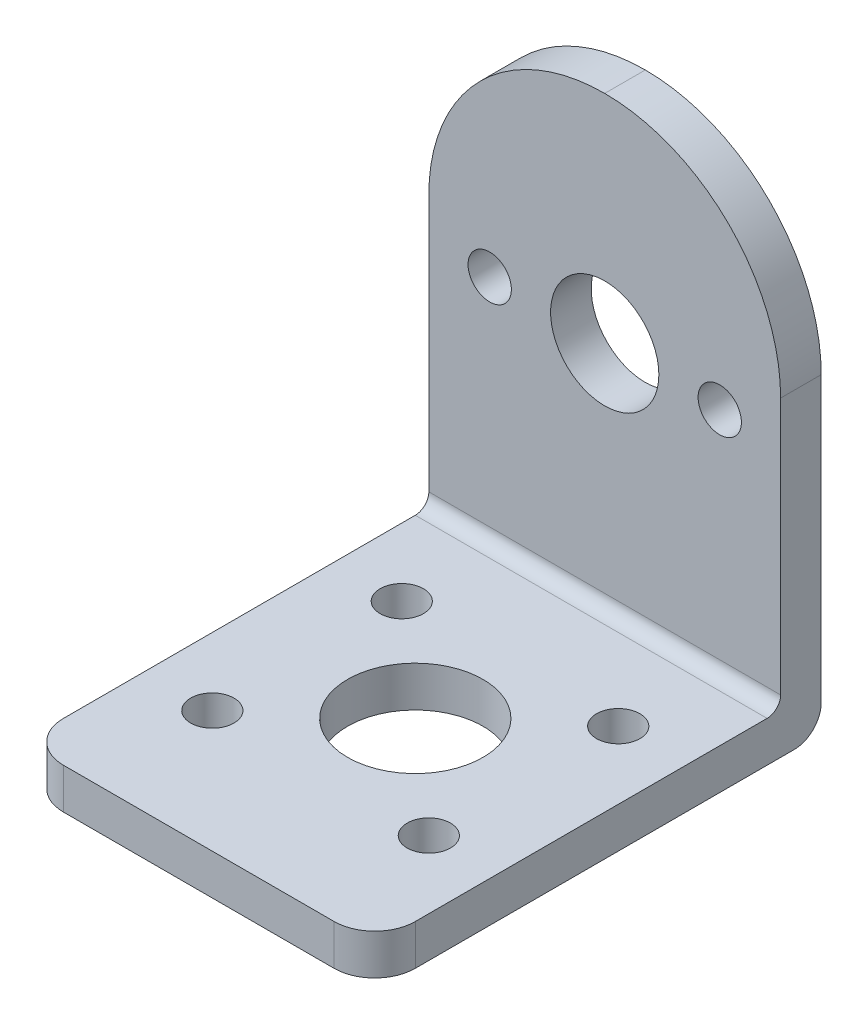
ISO-10303-21;
HEADER;
FILE_DESCRIPTION(('STEP AP214'),'2;1');
FILE_NAME('part.step','',(''),(''),'','','');
FILE_SCHEMA(('AUTOMOTIVE_DESIGN { 1 0 10303 214 1 1 1 1 }'));
ENDSEC;
DATA;
#1=APPLICATION_CONTEXT('core data for automotive mechanical design processes');
#2=APPLICATION_PROTOCOL_DEFINITION('international standard','automotive_design',2000,#1);
#3=PRODUCT_CONTEXT('',#1,'mechanical');
#4=PRODUCT('Part','Part','',(#3));
#5=PRODUCT_RELATED_PRODUCT_CATEGORY('part','',(#4));
#6=PRODUCT_DEFINITION_FORMATION('','',#4);
#7=PRODUCT_DEFINITION_CONTEXT('part definition',#1,'design');
#8=PRODUCT_DEFINITION('design','',#6,#7);
#9=PRODUCT_DEFINITION_SHAPE('','',#8);
#10=(LENGTH_UNIT() NAMED_UNIT(*) SI_UNIT(.MILLI.,.METRE.));
#11=(NAMED_UNIT(*) PLANE_ANGLE_UNIT() SI_UNIT($,.RADIAN.));
#12=(NAMED_UNIT(*) SI_UNIT($,.STERADIAN.) SOLID_ANGLE_UNIT());
#13=UNCERTAINTY_MEASURE_WITH_UNIT(LENGTH_MEASURE(1.E-05),#10,'distance_accuracy_value','');
#14=(GEOMETRIC_REPRESENTATION_CONTEXT(3) GLOBAL_UNCERTAINTY_ASSIGNED_CONTEXT((#13)) GLOBAL_UNIT_ASSIGNED_CONTEXT((#10,
#11,#12)) REPRESENTATION_CONTEXT('',''));
#15=CARTESIAN_POINT('',(0.,0.,0.));
#16=DIRECTION('',(0.,0.,1.));
#17=DIRECTION('',(1.,0.,0.));
#18=AXIS2_PLACEMENT_3D('',#15,#16,#17);
#19=CARTESIAN_POINT('',(0.,3.,0.));
#20=DIRECTION('',(0.,1.,0.));
#21=DIRECTION('',(0.,0.,1.));
#22=AXIS2_PLACEMENT_3D('',#19,#20,#21);
#23=PLANE('',#22);
#24=DIRECTION('',(0.,0.,-1.));
#25=VECTOR('',#24,1.);
#26=CARTESIAN_POINT('',(13.,3.,-16.5));
#27=LINE('',#26,#25);
#28=CARTESIAN_POINT('',(13.,3.,13.5));
#29=VERTEX_POINT('',#28);
#30=CARTESIAN_POINT('',(13.,3.,-12.5));
#31=VERTEX_POINT('',#30);
#32=EDGE_CURVE('E151',#29,#31,#27,.T.);
#33=ORIENTED_EDGE('',*,*,#32,.T.);
#34=DIRECTION('',(1.,0.,0.));
#35=VECTOR('',#34,1.);
#36=CARTESIAN_POINT('',(0.,3.,-12.5));
#37=LINE('',#36,#35);
#38=CARTESIAN_POINT('',(-13.,3.,-12.5));
#39=VERTEX_POINT('',#38);
#40=EDGE_CURVE('E61',#31,#39,#37,.F.);
#41=ORIENTED_EDGE('',*,*,#40,.T.);
#42=DIRECTION('',(0.,0.,1.));
#43=VECTOR('',#42,1.);
#44=CARTESIAN_POINT('',(-13.,3.,-16.5));
#45=LINE('',#44,#43);
#46=CARTESIAN_POINT('',(-13.,3.,13.5));
#47=VERTEX_POINT('',#46);
#48=EDGE_CURVE('E156',#39,#47,#45,.T.);
#49=ORIENTED_EDGE('',*,*,#48,.T.);
#50=CARTESIAN_POINT('',(-9.99999999999999,3.,13.5));
#51=DIRECTION('',(0.,1.,0.));
#52=DIRECTION('',(0.,0.,1.));
#53=AXIS2_PLACEMENT_3D('',#50,#51,#52);
#54=CIRCLE('',#53,3.);
#55=CARTESIAN_POINT('',(-9.99999999999999,3.,16.5));
#56=VERTEX_POINT('',#55);
#57=EDGE_CURVE('E179',#47,#56,#54,.T.);
#58=ORIENTED_EDGE('',*,*,#57,.T.);
#59=DIRECTION('',(1.,0.,0.));
#60=VECTOR('',#59,1.);
#61=CARTESIAN_POINT('',(-13.,3.,16.5));
#62=LINE('',#61,#60);
#63=CARTESIAN_POINT('',(10.,3.,16.5));
#64=VERTEX_POINT('',#63);
#65=EDGE_CURVE('E143',#56,#64,#62,.T.);
#66=ORIENTED_EDGE('',*,*,#65,.T.);
#67=CARTESIAN_POINT('',(10.,3.,13.5));
#68=DIRECTION('',(0.,1.,0.));
#69=DIRECTION('',(0.,0.,1.));
#70=AXIS2_PLACEMENT_3D('',#67,#68,#69);
#71=CIRCLE('',#70,3.);
#72=EDGE_CURVE('E176',#64,#29,#71,.T.);
#73=ORIENTED_EDGE('',*,*,#72,.T.);
#74=EDGE_LOOP('',(#33,#41,#49,#58,#66,#73));
#75=FACE_BOUND('',#74,.T.);
#76=CARTESIAN_POINT('',(7.99999999999999,3.,7.49999999999999));
#77=DIRECTION('',(0.,1.,0.));
#78=DIRECTION('',(0.,0.,-1.));
#79=AXIS2_PLACEMENT_3D('',#76,#77,#78);
#80=CIRCLE('',#79,1.6);
#81=CARTESIAN_POINT('',(7.99999999999999,3.,5.89999999999999));
#82=VERTEX_POINT('',#81);
#83=EDGE_CURVE('E261',#82,#82,#80,.T.);
#84=ORIENTED_EDGE('',*,*,#83,.F.);
#85=EDGE_LOOP('',(#84));
#86=FACE_BOUND('',#85,.T.);
#87=CARTESIAN_POINT('',(8.,3.,-6.5));
#88=DIRECTION('',(0.,1.,0.));
#89=DIRECTION('',(0.,0.,1.));
#90=AXIS2_PLACEMENT_3D('',#87,#88,#89);
#91=CIRCLE('',#90,1.6);
#92=CARTESIAN_POINT('',(8.,3.,-4.9));
#93=VERTEX_POINT('',#92);
#94=EDGE_CURVE('E247',#93,#93,#91,.T.);
#95=ORIENTED_EDGE('',*,*,#94,.F.);
#96=EDGE_LOOP('',(#95));
#97=FACE_BOUND('',#96,.T.);
#98=CARTESIAN_POINT('',(0.,3.,0.5));
#99=DIRECTION('',(0.,1.,0.));
#100=DIRECTION('',(0.,0.,1.));
#101=AXIS2_PLACEMENT_3D('',#98,#99,#100);
#102=CIRCLE('',#101,5.);
#103=CARTESIAN_POINT('',(0.,3.,5.5));
#104=VERTEX_POINT('',#103);
#105=EDGE_CURVE('E237',#104,#104,#102,.T.);
#106=ORIENTED_EDGE('',*,*,#105,.F.);
#107=EDGE_LOOP('',(#106));
#108=FACE_BOUND('',#107,.T.);
#109=CARTESIAN_POINT('',(-8.00000000000001,3.,-6.5));
#110=DIRECTION('',(0.,1.,0.));
#111=DIRECTION('',(0.,0.,-1.));
#112=AXIS2_PLACEMENT_3D('',#109,#110,#111);
#113=CIRCLE('',#112,1.6);
#114=CARTESIAN_POINT('',(-8.00000000000001,3.,-8.1));
#115=VERTEX_POINT('',#114);
#116=EDGE_CURVE('E253',#115,#115,#113,.T.);
#117=ORIENTED_EDGE('',*,*,#116,.F.);
#118=EDGE_LOOP('',(#117));
#119=FACE_BOUND('',#118,.T.);
#120=CARTESIAN_POINT('',(-8.00000000000001,3.,7.5));
#121=DIRECTION('',(0.,1.,0.));
#122=DIRECTION('',(0.,0.,1.));
#123=AXIS2_PLACEMENT_3D('',#120,#121,#122);
#124=CIRCLE('',#123,1.6);
#125=CARTESIAN_POINT('',(-8.00000000000001,3.,9.1));
#126=VERTEX_POINT('',#125);
#127=EDGE_CURVE('E269',#126,#126,#124,.T.);
#128=ORIENTED_EDGE('',*,*,#127,.F.);
#129=EDGE_LOOP('',(#128));
#130=FACE_BOUND('',#129,.T.);
#131=ADVANCED_FACE('F39',(#75,#86,#97,#108,#119,#130),#23,.T.);
#132=CARTESIAN_POINT('',(0.,0.,0.));
#133=DIRECTION('',(0.,1.,0.));
#134=DIRECTION('',(0.,0.,1.));
#135=AXIS2_PLACEMENT_3D('',#132,#133,#134);
#136=PLANE('',#135);
#137=DIRECTION('',(0.,0.,1.));
#138=VECTOR('',#137,1.);
#139=CARTESIAN_POINT('',(-13.,0.,-16.5));
#140=LINE('',#139,#138);
#141=CARTESIAN_POINT('',(-13.,0.,-14.5));
#142=VERTEX_POINT('',#141);
#143=CARTESIAN_POINT('',(-13.,0.,13.5));
#144=VERTEX_POINT('',#143);
#145=EDGE_CURVE('E152',#142,#144,#140,.T.);
#146=ORIENTED_EDGE('',*,*,#145,.F.);
#147=DIRECTION('',(-1.,0.,0.));
#148=VECTOR('',#147,1.);
#149=CARTESIAN_POINT('',(0.,0.,-14.5));
#150=LINE('',#149,#148);
#151=CARTESIAN_POINT('',(13.,0.,-14.5));
#152=VERTEX_POINT('',#151);
#153=EDGE_CURVE('E218',#142,#152,#150,.F.);
#154=ORIENTED_EDGE('',*,*,#153,.T.);
#155=DIRECTION('',(0.,0.,-1.));
#156=VECTOR('',#155,1.);
#157=CARTESIAN_POINT('',(13.,0.,-16.5));
#158=LINE('',#157,#156);
#159=CARTESIAN_POINT('',(13.,0.,13.5));
#160=VERTEX_POINT('',#159);
#161=EDGE_CURVE('E158',#160,#152,#158,.T.);
#162=ORIENTED_EDGE('',*,*,#161,.F.);
#163=CARTESIAN_POINT('',(10.,0.,13.5));
#164=DIRECTION('',(0.,1.,0.));
#165=DIRECTION('',(0.,0.,1.));
#166=AXIS2_PLACEMENT_3D('',#163,#164,#165);
#167=CIRCLE('',#166,3.);
#168=CARTESIAN_POINT('',(10.,0.,16.5));
#169=VERTEX_POINT('',#168);
#170=EDGE_CURVE('E134',#160,#169,#167,.F.);
#171=ORIENTED_EDGE('',*,*,#170,.T.);
#172=DIRECTION('',(1.,0.,0.));
#173=VECTOR('',#172,1.);
#174=CARTESIAN_POINT('',(-13.,0.,16.5));
#175=LINE('',#174,#173);
#176=CARTESIAN_POINT('',(-9.99999999999999,0.,16.5));
#177=VERTEX_POINT('',#176);
#178=EDGE_CURVE('E140',#177,#169,#175,.T.);
#179=ORIENTED_EDGE('',*,*,#178,.F.);
#180=CARTESIAN_POINT('',(-9.99999999999999,0.,13.5));
#181=DIRECTION('',(0.,1.,0.));
#182=DIRECTION('',(0.,0.,1.));
#183=AXIS2_PLACEMENT_3D('',#180,#181,#182);
#184=CIRCLE('',#183,3.);
#185=EDGE_CURVE('E123',#177,#144,#184,.F.);
#186=ORIENTED_EDGE('',*,*,#185,.T.);
#187=EDGE_LOOP('',(#146,#154,#162,#171,#179,#186));
#188=FACE_BOUND('',#187,.T.);
#189=CARTESIAN_POINT('',(0.,0.,0.5));
#190=DIRECTION('',(0.,1.,0.));
#191=DIRECTION('',(0.,0.,1.));
#192=AXIS2_PLACEMENT_3D('',#189,#190,#191);
#193=CIRCLE('',#192,5.);
#194=CARTESIAN_POINT('',(0.,0.,5.5));
#195=VERTEX_POINT('',#194);
#196=EDGE_CURVE('E241',#195,#195,#193,.T.);
#197=ORIENTED_EDGE('',*,*,#196,.T.);
#198=EDGE_LOOP('',(#197));
#199=FACE_BOUND('',#198,.T.);
#200=CARTESIAN_POINT('',(8.,0.,-6.5));
#201=DIRECTION('',(0.,1.,0.));
#202=DIRECTION('',(0.,0.,1.));
#203=AXIS2_PLACEMENT_3D('',#200,#201,#202);
#204=CIRCLE('',#203,1.6);
#205=CARTESIAN_POINT('',(8.,0.,-4.9));
#206=VERTEX_POINT('',#205);
#207=EDGE_CURVE('E249',#206,#206,#204,.T.);
#208=ORIENTED_EDGE('',*,*,#207,.T.);
#209=EDGE_LOOP('',(#208));
#210=FACE_BOUND('',#209,.T.);
#211=CARTESIAN_POINT('',(-8.00000000000001,0.,-6.5));
#212=DIRECTION('',(0.,1.,0.));
#213=DIRECTION('',(0.,0.,-1.));
#214=AXIS2_PLACEMENT_3D('',#211,#212,#213);
#215=CIRCLE('',#214,1.6);
#216=CARTESIAN_POINT('',(-8.00000000000001,0.,-8.1));
#217=VERTEX_POINT('',#216);
#218=EDGE_CURVE('E257',#217,#217,#215,.T.);
#219=ORIENTED_EDGE('',*,*,#218,.T.);
#220=EDGE_LOOP('',(#219));
#221=FACE_BOUND('',#220,.T.);
#222=CARTESIAN_POINT('',(7.99999999999999,0.,7.49999999999999));
#223=DIRECTION('',(0.,1.,0.));
#224=DIRECTION('',(0.,0.,-1.));
#225=AXIS2_PLACEMENT_3D('',#222,#223,#224);
#226=CIRCLE('',#225,1.6);
#227=CARTESIAN_POINT('',(7.99999999999999,0.,5.89999999999999));
#228=VERTEX_POINT('',#227);
#229=EDGE_CURVE('E265',#228,#228,#226,.T.);
#230=ORIENTED_EDGE('',*,*,#229,.T.);
#231=EDGE_LOOP('',(#230));
#232=FACE_BOUND('',#231,.T.);
#233=CARTESIAN_POINT('',(-8.00000000000001,0.,7.5));
#234=DIRECTION('',(0.,1.,0.));
#235=DIRECTION('',(0.,0.,1.));
#236=AXIS2_PLACEMENT_3D('',#233,#234,#235);
#237=CIRCLE('',#236,1.6);
#238=CARTESIAN_POINT('',(-8.00000000000001,0.,9.1));
#239=VERTEX_POINT('',#238);
#240=EDGE_CURVE('E273',#239,#239,#237,.T.);
#241=ORIENTED_EDGE('',*,*,#240,.T.);
#242=EDGE_LOOP('',(#241));
#243=FACE_BOUND('',#242,.T.);
#244=ADVANCED_FACE('F147',(#188,#199,#210,#221,#232,#243),#136,.F.);
#245=CARTESIAN_POINT('',(13.,3.,-16.5));
#246=DIRECTION('',(-1.,0.,0.));
#247=DIRECTION('',(0.,0.,1.));
#248=AXIS2_PLACEMENT_3D('',#245,#246,#247);
#249=PLANE('',#248);
#250=ORIENTED_EDGE('',*,*,#161,.T.);
#251=CARTESIAN_POINT('',(13.,2.,-14.5));
#252=DIRECTION('',(-1.,0.,0.));
#253=DIRECTION('',(0.,0.,1.));
#254=AXIS2_PLACEMENT_3D('',#251,#252,#253);
#255=CIRCLE('',#254,2.);
#256=CARTESIAN_POINT('',(13.,2.,-16.5));
#257=VERTEX_POINT('',#256);
#258=EDGE_CURVE('E221',#152,#257,#255,.F.);
#259=ORIENTED_EDGE('',*,*,#258,.T.);
#260=DIRECTION('',(0.,-1.,0.));
#261=VECTOR('',#260,1.);
#262=CARTESIAN_POINT('',(13.,3.,-16.5));
#263=LINE('',#262,#261);
#264=CARTESIAN_POINT('',(13.,23.,-16.5));
#265=VERTEX_POINT('',#264);
#266=EDGE_CURVE('E166',#265,#257,#263,.T.);
#267=ORIENTED_EDGE('',*,*,#266,.F.);
#268=DIRECTION('',(0.,0.,-1.));
#269=VECTOR('',#268,1.);
#270=CARTESIAN_POINT('',(13.,23.,-13.5));
#271=LINE('',#270,#269);
#272=CARTESIAN_POINT('',(13.,23.,-13.5));
#273=VERTEX_POINT('',#272);
#274=EDGE_CURVE('E202',#265,#273,#271,.F.);
#275=ORIENTED_EDGE('',*,*,#274,.T.);
#276=DIRECTION('',(0.,-1.,0.));
#277=VECTOR('',#276,1.);
#278=CARTESIAN_POINT('',(13.,36.,-13.5));
#279=LINE('',#278,#277);
#280=CARTESIAN_POINT('',(13.,4.,-13.5));
#281=VERTEX_POINT('',#280);
#282=EDGE_CURVE('E210',#273,#281,#279,.T.);
#283=ORIENTED_EDGE('',*,*,#282,.T.);
#284=CARTESIAN_POINT('',(13.,4.,-12.5));
#285=DIRECTION('',(-1.,0.,0.));
#286=DIRECTION('',(0.,0.,1.));
#287=AXIS2_PLACEMENT_3D('',#284,#285,#286);
#288=CIRCLE('',#287,1.);
#289=EDGE_CURVE('E48',#281,#31,#288,.T.);
#290=ORIENTED_EDGE('',*,*,#289,.T.);
#291=ORIENTED_EDGE('',*,*,#32,.F.);
#292=DIRECTION('',(0.,-1.,0.));
#293=VECTOR('',#292,1.);
#294=CARTESIAN_POINT('',(13.,3.,13.5));
#295=LINE('',#294,#293);
#296=EDGE_CURVE('E182',#29,#160,#295,.T.);
#297=ORIENTED_EDGE('',*,*,#296,.T.);
#298=EDGE_LOOP('',(#250,#259,#267,#275,#283,#290,#291,#297));
#299=FACE_BOUND('',#298,.T.);
#300=ADVANCED_FACE('F343',(#299),#249,.F.);
#301=CARTESIAN_POINT('',(-13.,3.,-16.5));
#302=DIRECTION('',(0.,0.,1.));
#303=DIRECTION('',(1.,0.,0.));
#304=AXIS2_PLACEMENT_3D('',#301,#302,#303);
#305=PLANE('',#304);
#306=CARTESIAN_POINT('',(-8.5,20.,-16.5));
#307=DIRECTION('',(0.,0.,1.));
#308=DIRECTION('',(-1.,0.,0.));
#309=AXIS2_PLACEMENT_3D('',#306,#307,#308);
#310=CIRCLE('',#309,1.6);
#311=CARTESIAN_POINT('',(-10.1,20.,-16.5));
#312=VERTEX_POINT('',#311);
#313=EDGE_CURVE('E298',#312,#312,#310,.T.);
#314=ORIENTED_EDGE('',*,*,#313,.T.);
#315=EDGE_LOOP('',(#314));
#316=FACE_BOUND('',#315,.T.);
#317=CARTESIAN_POINT('',(8.5,20.,-16.5));
#318=DIRECTION('',(0.,0.,1.));
#319=DIRECTION('',(1.,0.,0.));
#320=AXIS2_PLACEMENT_3D('',#317,#318,#319);
#321=CIRCLE('',#320,1.6);
#322=CARTESIAN_POINT('',(10.1,20.,-16.5));
#323=VERTEX_POINT('',#322);
#324=EDGE_CURVE('E290',#323,#323,#321,.T.);
#325=ORIENTED_EDGE('',*,*,#324,.T.);
#326=EDGE_LOOP('',(#325));
#327=FACE_BOUND('',#326,.T.);
#328=CARTESIAN_POINT('',(0.,20.,-16.5));
#329=DIRECTION('',(0.,0.,1.));
#330=DIRECTION('',(1.,0.,0.));
#331=AXIS2_PLACEMENT_3D('',#328,#329,#330);
#332=CIRCLE('',#331,4.);
#333=CARTESIAN_POINT('',(4.,20.,-16.5));
#334=VERTEX_POINT('',#333);
#335=EDGE_CURVE('E211',#334,#334,#332,.T.);
#336=ORIENTED_EDGE('',*,*,#335,.T.);
#337=EDGE_LOOP('',(#336));
#338=FACE_BOUND('',#337,.T.);
#339=ORIENTED_EDGE('',*,*,#266,.T.);
#340=DIRECTION('',(-1.,0.,0.));
#341=VECTOR('',#340,1.);
#342=CARTESIAN_POINT('',(-13.,2.,-16.5));
#343=LINE('',#342,#341);
#344=CARTESIAN_POINT('',(-13.,2.,-16.5));
#345=VERTEX_POINT('',#344);
#346=EDGE_CURVE('E205',#257,#345,#343,.T.);
#347=ORIENTED_EDGE('',*,*,#346,.T.);
#348=DIRECTION('',(0.,-1.,0.));
#349=VECTOR('',#348,1.);
#350=CARTESIAN_POINT('',(-13.,3.,-16.5));
#351=LINE('',#350,#349);
#352=CARTESIAN_POINT('',(-13.,23.,-16.5));
#353=VERTEX_POINT('',#352);
#354=EDGE_CURVE('E162',#353,#345,#351,.T.);
#355=ORIENTED_EDGE('',*,*,#354,.F.);
#356=CARTESIAN_POINT('',(0.,23.,-16.5));
#357=DIRECTION('',(0.,0.,1.));
#358=DIRECTION('',(1.,0.,0.));
#359=AXIS2_PLACEMENT_3D('',#356,#357,#358);
#360=CIRCLE('',#359,13.);
#361=CARTESIAN_POINT('',(0.,36.,-16.5));
#362=VERTEX_POINT('',#361);
#363=EDGE_CURVE('E199',#353,#362,#360,.F.);
#364=ORIENTED_EDGE('',*,*,#363,.T.);
#365=CARTESIAN_POINT('',(0.,23.,-16.5));
#366=DIRECTION('',(0.,0.,1.));
#367=DIRECTION('',(1.,0.,0.));
#368=AXIS2_PLACEMENT_3D('',#365,#366,#367);
#369=CIRCLE('',#368,13.);
#370=EDGE_CURVE('E196',#362,#265,#369,.F.);
#371=ORIENTED_EDGE('',*,*,#370,.T.);
#372=EDGE_LOOP('',(#339,#347,#355,#364,#371));
#373=FACE_BOUND('',#372,.T.);
#374=ADVANCED_FACE('F310',(#316,#327,#338,#373),#305,.F.);
#375=CARTESIAN_POINT('',(-13.,3.,-16.5));
#376=DIRECTION('',(1.,0.,0.));
#377=DIRECTION('',(0.,0.,-1.));
#378=AXIS2_PLACEMENT_3D('',#375,#376,#377);
#379=PLANE('',#378);
#380=ORIENTED_EDGE('',*,*,#354,.T.);
#381=CARTESIAN_POINT('',(-13.,2.,-14.5));
#382=DIRECTION('',(1.,0.,0.));
#383=DIRECTION('',(0.,0.,-1.));
#384=AXIS2_PLACEMENT_3D('',#381,#382,#383);
#385=CIRCLE('',#384,2.);
#386=EDGE_CURVE('E215',#345,#142,#385,.F.);
#387=ORIENTED_EDGE('',*,*,#386,.T.);
#388=ORIENTED_EDGE('',*,*,#145,.T.);
#389=DIRECTION('',(0.,-1.,0.));
#390=VECTOR('',#389,1.);
#391=CARTESIAN_POINT('',(-13.,3.,13.5));
#392=LINE('',#391,#390);
#393=EDGE_CURVE('E129',#144,#47,#392,.F.);
#394=ORIENTED_EDGE('',*,*,#393,.T.);
#395=ORIENTED_EDGE('',*,*,#48,.F.);
#396=CARTESIAN_POINT('',(-13.,4.,-12.5));
#397=DIRECTION('',(1.,0.,0.));
#398=DIRECTION('',(0.,0.,-1.));
#399=AXIS2_PLACEMENT_3D('',#396,#397,#398);
#400=CIRCLE('',#399,1.);
#401=CARTESIAN_POINT('',(-13.,4.,-13.5));
#402=VERTEX_POINT('',#401);
#403=EDGE_CURVE('E11',#39,#402,#400,.T.);
#404=ORIENTED_EDGE('',*,*,#403,.T.);
#405=DIRECTION('',(0.,-1.,0.));
#406=VECTOR('',#405,1.);
#407=CARTESIAN_POINT('',(-13.,36.,-13.5));
#408=LINE('',#407,#406);
#409=CARTESIAN_POINT('',(-13.,23.,-13.5));
#410=VERTEX_POINT('',#409);
#411=EDGE_CURVE('E277',#410,#402,#408,.T.);
#412=ORIENTED_EDGE('',*,*,#411,.F.);
#413=DIRECTION('',(0.,0.,1.));
#414=VECTOR('',#413,1.);
#415=CARTESIAN_POINT('',(-13.,23.,-16.5));
#416=LINE('',#415,#414);
#417=EDGE_CURVE('E192',#410,#353,#416,.F.);
#418=ORIENTED_EDGE('',*,*,#417,.T.);
#419=EDGE_LOOP('',(#380,#387,#388,#394,#395,#404,#412,#418));
#420=FACE_BOUND('',#419,.T.);
#421=ADVANCED_FACE('F338',(#420),#379,.F.);
#422=CARTESIAN_POINT('',(-13.,3.,16.5));
#423=DIRECTION('',(0.,0.,-1.));
#424=DIRECTION('',(-1.,0.,0.));
#425=AXIS2_PLACEMENT_3D('',#422,#423,#424);
#426=PLANE('',#425);
#427=ORIENTED_EDGE('',*,*,#65,.F.);
#428=DIRECTION('',(0.,-1.,0.));
#429=VECTOR('',#428,1.);
#430=CARTESIAN_POINT('',(-9.99999999999999,3.,16.5));
#431=LINE('',#430,#429);
#432=EDGE_CURVE('E127',#56,#177,#431,.T.);
#433=ORIENTED_EDGE('',*,*,#432,.T.);
#434=ORIENTED_EDGE('',*,*,#178,.T.);
#435=DIRECTION('',(0.,-1.,0.));
#436=VECTOR('',#435,1.);
#437=CARTESIAN_POINT('',(10.,3.,16.5));
#438=LINE('',#437,#436);
#439=EDGE_CURVE('E145',#169,#64,#438,.F.);
#440=ORIENTED_EDGE('',*,*,#439,.T.);
#441=EDGE_LOOP('',(#427,#433,#434,#440));
#442=FACE_BOUND('',#441,.T.);
#443=ADVANCED_FACE('F139',(#442),#426,.F.);
#444=CARTESIAN_POINT('',(0.,3.,0.5));
#445=DIRECTION('',(0.,-1.,0.));
#446=DIRECTION('',(0.,0.,-1.));
#447=AXIS2_PLACEMENT_3D('',#444,#445,#446);
#448=CYLINDRICAL_SURFACE('',#447,5.);
#449=ORIENTED_EDGE('',*,*,#105,.T.);
#450=EDGE_LOOP('',(#449));
#451=FACE_BOUND('',#450,.T.);
#452=ORIENTED_EDGE('',*,*,#196,.F.);
#453=EDGE_LOOP('',(#452));
#454=FACE_BOUND('',#453,.T.);
#455=ADVANCED_FACE('F375',(#451,#454),#448,.F.);
#456=CARTESIAN_POINT('',(8.,3.,-6.5));
#457=DIRECTION('',(0.,-1.,0.));
#458=DIRECTION('',(0.,0.,-1.));
#459=AXIS2_PLACEMENT_3D('',#456,#457,#458);
#460=CYLINDRICAL_SURFACE('',#459,1.6);
#461=ORIENTED_EDGE('',*,*,#94,.T.);
#462=EDGE_LOOP('',(#461));
#463=FACE_BOUND('',#462,.T.);
#464=ORIENTED_EDGE('',*,*,#207,.F.);
#465=EDGE_LOOP('',(#464));
#466=FACE_BOUND('',#465,.T.);
#467=ADVANCED_FACE('F482',(#463,#466),#460,.F.);
#468=CARTESIAN_POINT('',(-8.00000000000001,3.,-6.5));
#469=DIRECTION('',(0.,-1.,0.));
#470=DIRECTION('',(0.,0.,-1.));
#471=AXIS2_PLACEMENT_3D('',#468,#469,#470);
#472=CYLINDRICAL_SURFACE('',#471,1.6);
#473=ORIENTED_EDGE('',*,*,#116,.T.);
#474=EDGE_LOOP('',(#473));
#475=FACE_BOUND('',#474,.T.);
#476=ORIENTED_EDGE('',*,*,#218,.F.);
#477=EDGE_LOOP('',(#476));
#478=FACE_BOUND('',#477,.T.);
#479=ADVANCED_FACE('F488',(#475,#478),#472,.F.);
#480=CARTESIAN_POINT('',(7.99999999999999,3.,7.49999999999999));
#481=DIRECTION('',(0.,-1.,0.));
#482=DIRECTION('',(0.,0.,-1.));
#483=AXIS2_PLACEMENT_3D('',#480,#481,#482);
#484=CYLINDRICAL_SURFACE('',#483,1.6);
#485=ORIENTED_EDGE('',*,*,#83,.T.);
#486=EDGE_LOOP('',(#485));
#487=FACE_BOUND('',#486,.T.);
#488=ORIENTED_EDGE('',*,*,#229,.F.);
#489=EDGE_LOOP('',(#488));
#490=FACE_BOUND('',#489,.T.);
#491=ADVANCED_FACE('F495',(#487,#490),#484,.F.);
#492=CARTESIAN_POINT('',(-8.00000000000001,3.,7.5));
#493=DIRECTION('',(0.,-1.,0.));
#494=DIRECTION('',(0.,0.,-1.));
#495=AXIS2_PLACEMENT_3D('',#492,#493,#494);
#496=CYLINDRICAL_SURFACE('',#495,1.6);
#497=ORIENTED_EDGE('',*,*,#127,.T.);
#498=EDGE_LOOP('',(#497));
#499=FACE_BOUND('',#498,.T.);
#500=ORIENTED_EDGE('',*,*,#240,.F.);
#501=EDGE_LOOP('',(#500));
#502=FACE_BOUND('',#501,.T.);
#503=ADVANCED_FACE('F388',(#499,#502),#496,.F.);
#504=CARTESIAN_POINT('',(-9.99999999999999,3.,13.5));
#505=DIRECTION('',(0.,-1.,0.));
#506=DIRECTION('',(0.,0.,-1.));
#507=AXIS2_PLACEMENT_3D('',#504,#505,#506);
#508=CYLINDRICAL_SURFACE('',#507,3.);
#509=ORIENTED_EDGE('',*,*,#57,.F.);
#510=ORIENTED_EDGE('',*,*,#393,.F.);
#511=ORIENTED_EDGE('',*,*,#185,.F.);
#512=ORIENTED_EDGE('',*,*,#432,.F.);
#513=EDGE_LOOP('',(#509,#510,#511,#512));
#514=FACE_BOUND('',#513,.T.);
#515=ADVANCED_FACE('F126',(#514),#508,.T.);
#516=CARTESIAN_POINT('',(10.,3.,13.5));
#517=DIRECTION('',(0.,-1.,0.));
#518=DIRECTION('',(0.,0.,-1.));
#519=AXIS2_PLACEMENT_3D('',#516,#517,#518);
#520=CYLINDRICAL_SURFACE('',#519,3.);
#521=ORIENTED_EDGE('',*,*,#72,.F.);
#522=ORIENTED_EDGE('',*,*,#439,.F.);
#523=ORIENTED_EDGE('',*,*,#170,.F.);
#524=ORIENTED_EDGE('',*,*,#296,.F.);
#525=EDGE_LOOP('',(#521,#522,#523,#524));
#526=FACE_BOUND('',#525,.T.);
#527=ADVANCED_FACE('F325',(#526),#520,.T.);
#528=CARTESIAN_POINT('',(-13.,36.,-13.5));
#529=DIRECTION('',(0.,0.,-1.));
#530=DIRECTION('',(-1.,0.,0.));
#531=AXIS2_PLACEMENT_3D('',#528,#529,#530);
#532=PLANE('',#531);
#533=CARTESIAN_POINT('',(-8.5,20.,-13.5));
#534=DIRECTION('',(0.,0.,1.));
#535=DIRECTION('',(-1.,0.,0.));
#536=AXIS2_PLACEMENT_3D('',#533,#534,#535);
#537=CIRCLE('',#536,1.6);
#538=CARTESIAN_POINT('',(-10.1,20.,-13.5));
#539=VERTEX_POINT('',#538);
#540=EDGE_CURVE('E294',#539,#539,#537,.T.);
#541=ORIENTED_EDGE('',*,*,#540,.F.);
#542=EDGE_LOOP('',(#541));
#543=FACE_BOUND('',#542,.T.);
#544=CARTESIAN_POINT('',(8.5,20.,-13.5));
#545=DIRECTION('',(0.,0.,1.));
#546=DIRECTION('',(1.,0.,0.));
#547=AXIS2_PLACEMENT_3D('',#544,#545,#546);
#548=CIRCLE('',#547,1.6);
#549=CARTESIAN_POINT('',(10.1,20.,-13.5));
#550=VERTEX_POINT('',#549);
#551=EDGE_CURVE('E302',#550,#550,#548,.T.);
#552=ORIENTED_EDGE('',*,*,#551,.F.);
#553=EDGE_LOOP('',(#552));
#554=FACE_BOUND('',#553,.T.);
#555=CARTESIAN_POINT('',(0.,20.,-13.5));
#556=DIRECTION('',(0.,0.,1.));
#557=DIRECTION('',(1.,0.,0.));
#558=AXIS2_PLACEMENT_3D('',#555,#556,#557);
#559=CIRCLE('',#558,4.);
#560=CARTESIAN_POINT('',(4.,20.,-13.5));
#561=VERTEX_POINT('',#560);
#562=EDGE_CURVE('E286',#561,#561,#559,.T.);
#563=ORIENTED_EDGE('',*,*,#562,.F.);
#564=EDGE_LOOP('',(#563));
#565=FACE_BOUND('',#564,.T.);
#566=ORIENTED_EDGE('',*,*,#411,.T.);
#567=DIRECTION('',(1.,0.,0.));
#568=VECTOR('',#567,1.);
#569=CARTESIAN_POINT('',(-13.,4.,-13.5));
#570=LINE('',#569,#568);
#571=EDGE_CURVE('E224',#402,#281,#570,.T.);
#572=ORIENTED_EDGE('',*,*,#571,.T.);
#573=ORIENTED_EDGE('',*,*,#282,.F.);
#574=CARTESIAN_POINT('',(0.,23.,-13.5));
#575=DIRECTION('',(0.,0.,-1.));
#576=DIRECTION('',(-1.,0.,0.));
#577=AXIS2_PLACEMENT_3D('',#574,#575,#576);
#578=CIRCLE('',#577,13.);
#579=CARTESIAN_POINT('',(0.,36.,-13.5));
#580=VERTEX_POINT('',#579);
#581=EDGE_CURVE('E186',#273,#580,#578,.F.);
#582=ORIENTED_EDGE('',*,*,#581,.T.);
#583=CARTESIAN_POINT('',(0.,23.,-13.5));
#584=DIRECTION('',(0.,0.,-1.));
#585=DIRECTION('',(-1.,0.,0.));
#586=AXIS2_PLACEMENT_3D('',#583,#584,#585);
#587=CIRCLE('',#586,13.);
#588=EDGE_CURVE('E189',#580,#410,#587,.F.);
#589=ORIENTED_EDGE('',*,*,#588,.T.);
#590=EDGE_LOOP('',(#566,#572,#573,#582,#589));
#591=FACE_BOUND('',#590,.T.);
#592=ADVANCED_FACE('F321',(#543,#554,#565,#591),#532,.F.);
#593=CARTESIAN_POINT('',(0.,23.,0.));
#594=DIRECTION('',(0.,0.,1.));
#595=DIRECTION('',(1.,0.,0.));
#596=AXIS2_PLACEMENT_3D('',#593,#594,#595);
#597=CYLINDRICAL_SURFACE('',#596,13.);
#598=ORIENTED_EDGE('',*,*,#274,.F.);
#599=ORIENTED_EDGE('',*,*,#370,.F.);
#600=DIRECTION('',(0.,0.,-1.));
#601=VECTOR('',#600,1.);
#602=CARTESIAN_POINT('',(0.,36.,-16.5));
#603=LINE('',#602,#601);
#604=EDGE_CURVE('E206',#580,#362,#603,.T.);
#605=ORIENTED_EDGE('',*,*,#604,.F.);
#606=ORIENTED_EDGE('',*,*,#581,.F.);
#607=EDGE_LOOP('',(#598,#599,#605,#606));
#608=FACE_BOUND('',#607,.T.);
#609=ADVANCED_FACE('F324',(#608),#597,.T.);
#610=CARTESIAN_POINT('',(0.,23.,0.));
#611=DIRECTION('',(0.,0.,-1.));
#612=DIRECTION('',(-1.,0.,0.));
#613=AXIS2_PLACEMENT_3D('',#610,#611,#612);
#614=CYLINDRICAL_SURFACE('',#613,13.);
#615=ORIENTED_EDGE('',*,*,#363,.F.);
#616=ORIENTED_EDGE('',*,*,#417,.F.);
#617=ORIENTED_EDGE('',*,*,#588,.F.);
#618=ORIENTED_EDGE('',*,*,#604,.T.);
#619=EDGE_LOOP('',(#615,#616,#617,#618));
#620=FACE_BOUND('',#619,.T.);
#621=ADVANCED_FACE('F357',(#620),#614,.T.);
#622=CARTESIAN_POINT('',(0.,20.,-16.5));
#623=DIRECTION('',(0.,0.,1.));
#624=DIRECTION('',(1.,0.,0.));
#625=AXIS2_PLACEMENT_3D('',#622,#623,#624);
#626=CYLINDRICAL_SURFACE('',#625,4.);
#627=ORIENTED_EDGE('',*,*,#335,.F.);
#628=EDGE_LOOP('',(#627));
#629=FACE_BOUND('',#628,.T.);
#630=ORIENTED_EDGE('',*,*,#562,.T.);
#631=EDGE_LOOP('',(#630));
#632=FACE_BOUND('',#631,.T.);
#633=ADVANCED_FACE('F317',(#629,#632),#626,.F.);
#634=CARTESIAN_POINT('',(8.5,20.,-16.5));
#635=DIRECTION('',(0.,0.,1.));
#636=DIRECTION('',(1.,0.,0.));
#637=AXIS2_PLACEMENT_3D('',#634,#635,#636);
#638=CYLINDRICAL_SURFACE('',#637,1.6);
#639=ORIENTED_EDGE('',*,*,#324,.F.);
#640=EDGE_LOOP('',(#639));
#641=FACE_BOUND('',#640,.T.);
#642=ORIENTED_EDGE('',*,*,#551,.T.);
#643=EDGE_LOOP('',(#642));
#644=FACE_BOUND('',#643,.T.);
#645=ADVANCED_FACE('F313',(#641,#644),#638,.F.);
#646=CARTESIAN_POINT('',(-8.5,20.,-16.5));
#647=DIRECTION('',(0.,0.,1.));
#648=DIRECTION('',(1.,0.,0.));
#649=AXIS2_PLACEMENT_3D('',#646,#647,#648);
#650=CYLINDRICAL_SURFACE('',#649,1.6);
#651=ORIENTED_EDGE('',*,*,#313,.F.);
#652=EDGE_LOOP('',(#651));
#653=FACE_BOUND('',#652,.T.);
#654=ORIENTED_EDGE('',*,*,#540,.T.);
#655=EDGE_LOOP('',(#654));
#656=FACE_BOUND('',#655,.T.);
#657=ADVANCED_FACE('F316',(#653,#656),#650,.F.);
#658=CARTESIAN_POINT('',(-13.,2.,-14.5));
#659=DIRECTION('',(-1.,0.,0.));
#660=DIRECTION('',(0.,0.,1.));
#661=AXIS2_PLACEMENT_3D('',#658,#659,#660);
#662=CYLINDRICAL_SURFACE('',#661,2.);
#663=ORIENTED_EDGE('',*,*,#258,.F.);
#664=ORIENTED_EDGE('',*,*,#153,.F.);
#665=ORIENTED_EDGE('',*,*,#386,.F.);
#666=ORIENTED_EDGE('',*,*,#346,.F.);
#667=EDGE_LOOP('',(#663,#664,#665,#666));
#668=FACE_BOUND('',#667,.T.);
#669=ADVANCED_FACE('F346',(#668),#662,.T.);
#670=CARTESIAN_POINT('',(-13.,4.,-12.5));
#671=DIRECTION('',(1.,0.,0.));
#672=DIRECTION('',(0.,0.,-1.));
#673=AXIS2_PLACEMENT_3D('',#670,#671,#672);
#674=CYLINDRICAL_SURFACE('',#673,1.);
#675=ORIENTED_EDGE('',*,*,#403,.F.);
#676=ORIENTED_EDGE('',*,*,#40,.F.);
#677=ORIENTED_EDGE('',*,*,#289,.F.);
#678=ORIENTED_EDGE('',*,*,#571,.F.);
#679=EDGE_LOOP('',(#675,#676,#677,#678));
#680=FACE_BOUND('',#679,.T.);
#681=ADVANCED_FACE('F41',(#680),#674,.F.);
#682=CLOSED_SHELL('',(#131,#244,#300,#374,#421,#443,#455,#467,#479,#491,#503,#515,#527,#592,
#609,#621,#633,#645,#657,#669,#681));
#683=MANIFOLD_SOLID_BREP('B2',#682);
#684=ADVANCED_BREP_SHAPE_REPRESENTATION('',(#18,#683),#14);
#685=SHAPE_DEFINITION_REPRESENTATION(#9,#684);
ENDSEC;
END-ISO-10303-21;
